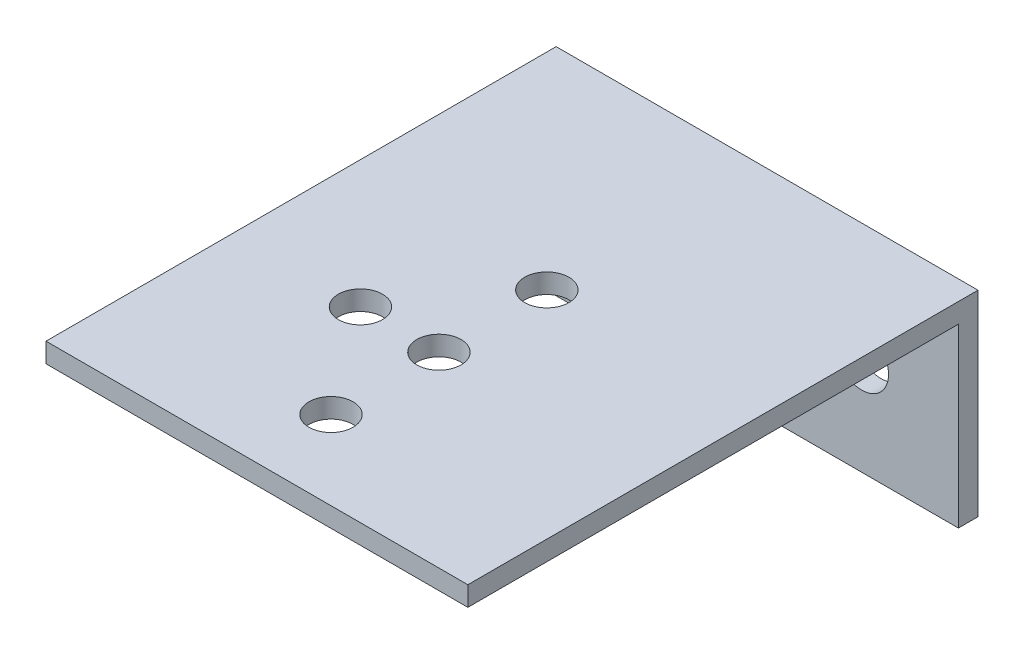
ISO-10303-21;
HEADER;
FILE_DESCRIPTION(('STEP AP214'),'2;1');
FILE_NAME('part.step','',(''),(''),'','','');
FILE_SCHEMA(('AUTOMOTIVE_DESIGN { 1 0 10303 214 1 1 1 1 }'));
ENDSEC;
DATA;
#1=APPLICATION_CONTEXT('core data for automotive mechanical design processes');
#2=APPLICATION_PROTOCOL_DEFINITION('international standard','automotive_design',2000,#1);
#3=PRODUCT_CONTEXT('',#1,'mechanical');
#4=PRODUCT('Part','Part','',(#3));
#5=PRODUCT_RELATED_PRODUCT_CATEGORY('part','',(#4));
#6=PRODUCT_DEFINITION_FORMATION('','',#4);
#7=PRODUCT_DEFINITION_CONTEXT('part definition',#1,'design');
#8=PRODUCT_DEFINITION('design','',#6,#7);
#9=PRODUCT_DEFINITION_SHAPE('','',#8);
#10=(LENGTH_UNIT() NAMED_UNIT(*) SI_UNIT(.MILLI.,.METRE.));
#11=(NAMED_UNIT(*) PLANE_ANGLE_UNIT() SI_UNIT($,.RADIAN.));
#12=(NAMED_UNIT(*) SI_UNIT($,.STERADIAN.) SOLID_ANGLE_UNIT());
#13=UNCERTAINTY_MEASURE_WITH_UNIT(LENGTH_MEASURE(1.E-05),#10,'distance_accuracy_value','');
#14=(GEOMETRIC_REPRESENTATION_CONTEXT(3) GLOBAL_UNCERTAINTY_ASSIGNED_CONTEXT((#13)) GLOBAL_UNIT_ASSIGNED_CONTEXT((#10,
#11,#12)) REPRESENTATION_CONTEXT('',''));
#15=CARTESIAN_POINT('',(0.,0.,0.));
#16=DIRECTION('',(0.,0.,1.));
#17=DIRECTION('',(1.,0.,0.));
#18=AXIS2_PLACEMENT_3D('',#15,#16,#17);
#19=CARTESIAN_POINT('',(-21.5,-10.,52.));
#20=DIRECTION('',(0.,1.,0.));
#21=DIRECTION('',(0.,0.,1.));
#22=AXIS2_PLACEMENT_3D('',#19,#20,#21);
#23=PLANE('',#22);
#24=DIRECTION('',(1.,0.,0.));
#25=VECTOR('',#24,1.);
#26=CARTESIAN_POINT('',(-21.5,-10.,1.99999999999999));
#27=LINE('',#26,#25);
#28=CARTESIAN_POINT('',(-21.5,-10.,1.99999999999999));
#29=VERTEX_POINT('',#28);
#30=CARTESIAN_POINT('',(21.5,-10.,1.99999999999999));
#31=VERTEX_POINT('',#30);
#32=EDGE_CURVE('E11',#29,#31,#27,.T.);
#33=ORIENTED_EDGE('',*,*,#32,.F.);
#34=DIRECTION('',(0.,0.,-1.));
#35=VECTOR('',#34,1.);
#36=CARTESIAN_POINT('',(-21.5,-10.,52.));
#37=LINE('',#36,#35);
#38=CARTESIAN_POINT('',(-21.5,-10.,0.));
#39=VERTEX_POINT('',#38);
#40=EDGE_CURVE('E89',#29,#39,#37,.T.);
#41=ORIENTED_EDGE('',*,*,#40,.T.);
#42=DIRECTION('',(1.,0.,0.));
#43=VECTOR('',#42,1.);
#44=CARTESIAN_POINT('',(-21.5,-10.,0.));
#45=LINE('',#44,#43);
#46=CARTESIAN_POINT('',(21.5,-10.,0.));
#47=VERTEX_POINT('',#46);
#48=EDGE_CURVE('E93',#39,#47,#45,.T.);
#49=ORIENTED_EDGE('',*,*,#48,.T.);
#50=DIRECTION('',(0.,0.,-1.));
#51=VECTOR('',#50,1.);
#52=CARTESIAN_POINT('',(21.5,-10.,52.));
#53=LINE('',#52,#51);
#54=EDGE_CURVE('E79',#31,#47,#53,.T.);
#55=ORIENTED_EDGE('',*,*,#54,.F.);
#56=EDGE_LOOP('',(#33,#41,#49,#55));
#57=FACE_BOUND('',#56,.T.);
#58=ADVANCED_FACE('F33',(#57),#23,.F.);
#59=CARTESIAN_POINT('',(21.5,-10.,52.));
#60=DIRECTION('',(-1.,0.,0.));
#61=DIRECTION('',(0.,0.,1.));
#62=AXIS2_PLACEMENT_3D('',#59,#60,#61);
#63=PLANE('',#62);
#64=DIRECTION('',(0.,1.,0.));
#65=VECTOR('',#64,1.);
#66=CARTESIAN_POINT('',(21.5,-10.,52.));
#67=LINE('',#66,#65);
#68=CARTESIAN_POINT('',(21.5,8.,52.));
#69=VERTEX_POINT('',#68);
#70=CARTESIAN_POINT('',(21.5,10.,52.));
#71=VERTEX_POINT('',#70);
#72=EDGE_CURVE('E98',#69,#71,#67,.T.);
#73=ORIENTED_EDGE('',*,*,#72,.F.);
#74=DIRECTION('',(0.,0.,-1.));
#75=VECTOR('',#74,1.);
#76=CARTESIAN_POINT('',(21.5,8.,52.));
#77=LINE('',#76,#75);
#78=CARTESIAN_POINT('',(21.5,8.,1.99999999999999));
#79=VERTEX_POINT('',#78);
#80=EDGE_CURVE('E50',#69,#79,#77,.T.);
#81=ORIENTED_EDGE('',*,*,#80,.T.);
#82=DIRECTION('',(0.,1.,0.));
#83=VECTOR('',#82,1.);
#84=CARTESIAN_POINT('',(21.5,-10.,1.99999999999999));
#85=LINE('',#84,#83);
#86=EDGE_CURVE('E86',#31,#79,#85,.T.);
#87=ORIENTED_EDGE('',*,*,#86,.F.);
#88=ORIENTED_EDGE('',*,*,#54,.T.);
#89=DIRECTION('',(0.,1.,0.));
#90=VECTOR('',#89,1.);
#91=CARTESIAN_POINT('',(21.5,-10.,0.));
#92=LINE('',#91,#90);
#93=CARTESIAN_POINT('',(21.5,10.,0.));
#94=VERTEX_POINT('',#93);
#95=EDGE_CURVE('E84',#47,#94,#92,.T.);
#96=ORIENTED_EDGE('',*,*,#95,.T.);
#97=DIRECTION('',(0.,0.,-1.));
#98=VECTOR('',#97,1.);
#99=CARTESIAN_POINT('',(21.5,10.,52.));
#100=LINE('',#99,#98);
#101=EDGE_CURVE('E116',#71,#94,#100,.T.);
#102=ORIENTED_EDGE('',*,*,#101,.F.);
#103=EDGE_LOOP('',(#73,#81,#87,#88,#96,#102));
#104=FACE_BOUND('',#103,.T.);
#105=ADVANCED_FACE('F35',(#104),#63,.F.);
#106=CARTESIAN_POINT('',(-21.5,10.,52.));
#107=DIRECTION('',(0.,-1.,0.));
#108=DIRECTION('',(0.,0.,-1.));
#109=AXIS2_PLACEMENT_3D('',#106,#107,#108);
#110=PLANE('',#109);
#111=CARTESIAN_POINT('',(-0.500000000201693,10.,21.9500000003336));
#112=DIRECTION('',(0.,1.,0.));
#113=DIRECTION('',(0.,0.,1.));
#114=AXIS2_PLACEMENT_3D('',#111,#112,#113);
#115=CIRCLE('',#114,2.24999999999999);
#116=CARTESIAN_POINT('',(-0.500000000201693,10.,24.2000000003335));
#117=VERTEX_POINT('',#116);
#118=EDGE_CURVE('E134',#117,#117,#115,.T.);
#119=ORIENTED_EDGE('',*,*,#118,.F.);
#120=EDGE_LOOP('',(#119));
#121=FACE_BOUND('',#120,.T.);
#122=CARTESIAN_POINT('',(-0.500000000201693,10.,32.9500000003336));
#123=DIRECTION('',(0.,1.,0.));
#124=DIRECTION('',(0.,0.,1.));
#125=AXIS2_PLACEMENT_3D('',#122,#123,#124);
#126=CIRCLE('',#125,2.24999999999999);
#127=CARTESIAN_POINT('',(-0.500000000201693,10.,35.2000000003335));
#128=VERTEX_POINT('',#127);
#129=EDGE_CURVE('E131',#128,#128,#126,.T.);
#130=ORIENTED_EDGE('',*,*,#129,.F.);
#131=EDGE_LOOP('',(#130));
#132=FACE_BOUND('',#131,.T.);
#133=CARTESIAN_POINT('',(-0.500000000201693,10.,43.9500000003336));
#134=DIRECTION('',(0.,1.,0.));
#135=DIRECTION('',(0.,0.,1.));
#136=AXIS2_PLACEMENT_3D('',#133,#134,#135);
#137=CIRCLE('',#136,2.24999999999999);
#138=CARTESIAN_POINT('',(-0.500000000201693,10.,46.2000000003335));
#139=VERTEX_POINT('',#138);
#140=EDGE_CURVE('E127',#139,#139,#137,.T.);
#141=ORIENTED_EDGE('',*,*,#140,.F.);
#142=EDGE_LOOP('',(#141));
#143=FACE_BOUND('',#142,.T.);
#144=CARTESIAN_POINT('',(-8.50000000020169,10.,32.9500000003336));
#145=DIRECTION('',(0.,1.,0.));
#146=DIRECTION('',(0.,0.,1.));
#147=AXIS2_PLACEMENT_3D('',#144,#145,#146);
#148=CIRCLE('',#147,2.24999999999999);
#149=CARTESIAN_POINT('',(-8.50000000020169,10.,35.2000000003335));
#150=VERTEX_POINT('',#149);
#151=EDGE_CURVE('E123',#150,#150,#148,.T.);
#152=ORIENTED_EDGE('',*,*,#151,.F.);
#153=EDGE_LOOP('',(#152));
#154=FACE_BOUND('',#153,.T.);
#155=DIRECTION('',(-1.,0.,0.));
#156=VECTOR('',#155,1.);
#157=CARTESIAN_POINT('',(-21.5,10.,0.));
#158=LINE('',#157,#156);
#159=CARTESIAN_POINT('',(-21.5,10.,0.));
#160=VERTEX_POINT('',#159);
#161=EDGE_CURVE('E102',#94,#160,#158,.T.);
#162=ORIENTED_EDGE('',*,*,#161,.T.);
#163=DIRECTION('',(0.,0.,-1.));
#164=VECTOR('',#163,1.);
#165=CARTESIAN_POINT('',(-21.5,10.,52.));
#166=LINE('',#165,#164);
#167=CARTESIAN_POINT('',(-21.5,10.,52.));
#168=VERTEX_POINT('',#167);
#169=EDGE_CURVE('E113',#168,#160,#166,.T.);
#170=ORIENTED_EDGE('',*,*,#169,.F.);
#171=DIRECTION('',(-1.,0.,0.));
#172=VECTOR('',#171,1.);
#173=CARTESIAN_POINT('',(-21.5,10.,52.));
#174=LINE('',#173,#172);
#175=EDGE_CURVE('E59',#71,#168,#174,.T.);
#176=ORIENTED_EDGE('',*,*,#175,.F.);
#177=ORIENTED_EDGE('',*,*,#101,.T.);
#178=EDGE_LOOP('',(#162,#170,#176,#177));
#179=FACE_BOUND('',#178,.T.);
#180=ADVANCED_FACE('F202',(#121,#132,#143,#154,#179),#110,.F.);
#181=CARTESIAN_POINT('',(-21.5,-10.,52.));
#182=DIRECTION('',(1.,0.,0.));
#183=DIRECTION('',(0.,0.,-1.));
#184=AXIS2_PLACEMENT_3D('',#181,#182,#183);
#185=PLANE('',#184);
#186=DIRECTION('',(0.,-1.,0.));
#187=VECTOR('',#186,1.);
#188=CARTESIAN_POINT('',(-21.5,-10.,1.99999999999999));
#189=LINE('',#188,#187);
#190=CARTESIAN_POINT('',(-21.5,8.,1.99999999999999));
#191=VERTEX_POINT('',#190);
#192=EDGE_CURVE('E106',#191,#29,#189,.T.);
#193=ORIENTED_EDGE('',*,*,#192,.F.);
#194=DIRECTION('',(0.,0.,1.));
#195=VECTOR('',#194,1.);
#196=CARTESIAN_POINT('',(-21.5,8.,52.));
#197=LINE('',#196,#195);
#198=CARTESIAN_POINT('',(-21.5,8.,52.));
#199=VERTEX_POINT('',#198);
#200=EDGE_CURVE('E158',#191,#199,#197,.T.);
#201=ORIENTED_EDGE('',*,*,#200,.T.);
#202=DIRECTION('',(0.,-1.,0.));
#203=VECTOR('',#202,1.);
#204=CARTESIAN_POINT('',(-21.5,-10.,52.));
#205=LINE('',#204,#203);
#206=EDGE_CURVE('E90',#168,#199,#205,.T.);
#207=ORIENTED_EDGE('',*,*,#206,.F.);
#208=ORIENTED_EDGE('',*,*,#169,.T.);
#209=DIRECTION('',(0.,-1.,0.));
#210=VECTOR('',#209,1.);
#211=CARTESIAN_POINT('',(-21.5,-10.,0.));
#212=LINE('',#211,#210);
#213=EDGE_CURVE('E99',#160,#39,#212,.T.);
#214=ORIENTED_EDGE('',*,*,#213,.T.);
#215=ORIENTED_EDGE('',*,*,#40,.F.);
#216=EDGE_LOOP('',(#193,#201,#207,#208,#214,#215));
#217=FACE_BOUND('',#216,.T.);
#218=ADVANCED_FACE('F171',(#217),#185,.F.);
#219=CARTESIAN_POINT('',(0.,0.,52.));
#220=DIRECTION('',(0.,0.,-1.));
#221=DIRECTION('',(-1.,0.,0.));
#222=AXIS2_PLACEMENT_3D('',#219,#220,#221);
#223=PLANE('',#222);
#224=ORIENTED_EDGE('',*,*,#206,.T.);
#225=DIRECTION('',(1.,0.,0.));
#226=VECTOR('',#225,1.);
#227=CARTESIAN_POINT('',(0.,8.,52.));
#228=LINE('',#227,#226);
#229=EDGE_CURVE('E42',#199,#69,#228,.T.);
#230=ORIENTED_EDGE('',*,*,#229,.T.);
#231=ORIENTED_EDGE('',*,*,#72,.T.);
#232=ORIENTED_EDGE('',*,*,#175,.T.);
#233=EDGE_LOOP('',(#224,#230,#231,#232));
#234=FACE_BOUND('',#233,.T.);
#235=ADVANCED_FACE('F166',(#234),#223,.F.);
#236=CARTESIAN_POINT('',(0.,0.,0.));
#237=DIRECTION('',(0.,0.,-1.));
#238=DIRECTION('',(-1.,0.,0.));
#239=AXIS2_PLACEMENT_3D('',#236,#237,#238);
#240=PLANE('',#239);
#241=CARTESIAN_POINT('',(11.632687114556,0.,0.));
#242=DIRECTION('',(0.,0.,-1.));
#243=DIRECTION('',(-1.,0.,0.));
#244=AXIS2_PLACEMENT_3D('',#241,#242,#243);
#245=CIRCLE('',#244,2.75);
#246=CARTESIAN_POINT('',(8.88268711455601,0.,0.));
#247=VERTEX_POINT('',#246);
#248=EDGE_CURVE('E147',#247,#247,#245,.T.);
#249=ORIENTED_EDGE('',*,*,#248,.F.);
#250=EDGE_LOOP('',(#249));
#251=FACE_BOUND('',#250,.T.);
#252=CARTESIAN_POINT('',(-8.68660375483188,0.,0.));
#253=DIRECTION('',(0.,0.,-1.));
#254=DIRECTION('',(-1.,0.,0.));
#255=AXIS2_PLACEMENT_3D('',#252,#253,#254);
#256=CIRCLE('',#255,2.75);
#257=CARTESIAN_POINT('',(-11.4366037548319,0.,0.));
#258=VERTEX_POINT('',#257);
#259=EDGE_CURVE('E137',#258,#258,#256,.T.);
#260=ORIENTED_EDGE('',*,*,#259,.F.);
#261=EDGE_LOOP('',(#260));
#262=FACE_BOUND('',#261,.T.);
#263=ORIENTED_EDGE('',*,*,#95,.F.);
#264=ORIENTED_EDGE('',*,*,#48,.F.);
#265=ORIENTED_EDGE('',*,*,#213,.F.);
#266=ORIENTED_EDGE('',*,*,#161,.F.);
#267=EDGE_LOOP('',(#263,#264,#265,#266));
#268=FACE_BOUND('',#267,.T.);
#269=ADVANCED_FACE('F101',(#251,#262,#268),#240,.T.);
#270=CARTESIAN_POINT('',(0.,0.,1.99999999999999));
#271=DIRECTION('',(0.,0.,1.));
#272=DIRECTION('',(1.,0.,0.));
#273=AXIS2_PLACEMENT_3D('',#270,#271,#272);
#274=PLANE('',#273);
#275=CARTESIAN_POINT('',(11.632687114556,0.,1.99999999999999));
#276=DIRECTION('',(0.,0.,1.));
#277=DIRECTION('',(1.,0.,0.));
#278=AXIS2_PLACEMENT_3D('',#275,#276,#277);
#279=CIRCLE('',#278,2.75);
#280=CARTESIAN_POINT('',(14.382687114556,0.,1.99999999999999));
#281=VERTEX_POINT('',#280);
#282=EDGE_CURVE('E37',#281,#281,#279,.T.);
#283=ORIENTED_EDGE('',*,*,#282,.F.);
#284=EDGE_LOOP('',(#283));
#285=FACE_BOUND('',#284,.T.);
#286=CARTESIAN_POINT('',(-8.68660375483188,0.,1.99999999999999));
#287=DIRECTION('',(0.,0.,1.));
#288=DIRECTION('',(1.,0.,0.));
#289=AXIS2_PLACEMENT_3D('',#286,#287,#288);
#290=CIRCLE('',#289,2.75);
#291=CARTESIAN_POINT('',(-5.93660375483188,0.,1.99999999999999));
#292=VERTEX_POINT('',#291);
#293=EDGE_CURVE('E135',#292,#292,#290,.T.);
#294=ORIENTED_EDGE('',*,*,#293,.F.);
#295=EDGE_LOOP('',(#294));
#296=FACE_BOUND('',#295,.T.);
#297=ORIENTED_EDGE('',*,*,#86,.T.);
#298=DIRECTION('',(-1.,0.,0.));
#299=VECTOR('',#298,1.);
#300=CARTESIAN_POINT('',(30.2088614005527,8.,1.99999999999999));
#301=LINE('',#300,#299);
#302=EDGE_CURVE('E122',#79,#191,#301,.T.);
#303=ORIENTED_EDGE('',*,*,#302,.T.);
#304=ORIENTED_EDGE('',*,*,#192,.T.);
#305=ORIENTED_EDGE('',*,*,#32,.T.);
#306=EDGE_LOOP('',(#297,#303,#304,#305));
#307=FACE_BOUND('',#306,.T.);
#308=ADVANCED_FACE('F178',(#285,#296,#307),#274,.T.);
#309=CARTESIAN_POINT('',(30.2088614005527,8.,1.99999999999999));
#310=DIRECTION('',(0.,1.,0.));
#311=DIRECTION('',(0.,0.,1.));
#312=AXIS2_PLACEMENT_3D('',#309,#310,#311);
#313=PLANE('',#312);
#314=CARTESIAN_POINT('',(-0.500000000201693,8.,21.9500000003336));
#315=DIRECTION('',(0.,1.,0.));
#316=DIRECTION('',(0.,0.,1.));
#317=AXIS2_PLACEMENT_3D('',#314,#315,#316);
#318=CIRCLE('',#317,2.24999999999999);
#319=CARTESIAN_POINT('',(-0.500000000201693,8.,24.2000000003335));
#320=VERTEX_POINT('',#319);
#321=EDGE_CURVE('E132',#320,#320,#318,.T.);
#322=ORIENTED_EDGE('',*,*,#321,.T.);
#323=EDGE_LOOP('',(#322));
#324=FACE_BOUND('',#323,.T.);
#325=CARTESIAN_POINT('',(-0.500000000201693,8.,32.9500000003336));
#326=DIRECTION('',(0.,1.,0.));
#327=DIRECTION('',(0.,0.,1.));
#328=AXIS2_PLACEMENT_3D('',#325,#326,#327);
#329=CIRCLE('',#328,2.24999999999999);
#330=CARTESIAN_POINT('',(-0.500000000201693,8.,35.2000000003336));
#331=VERTEX_POINT('',#330);
#332=EDGE_CURVE('E128',#331,#331,#329,.T.);
#333=ORIENTED_EDGE('',*,*,#332,.T.);
#334=EDGE_LOOP('',(#333));
#335=FACE_BOUND('',#334,.T.);
#336=CARTESIAN_POINT('',(-0.500000000201693,8.,43.9500000003336));
#337=DIRECTION('',(0.,1.,0.));
#338=DIRECTION('',(0.,0.,1.));
#339=AXIS2_PLACEMENT_3D('',#336,#337,#338);
#340=CIRCLE('',#339,2.24999999999999);
#341=CARTESIAN_POINT('',(-0.500000000201693,8.,46.2000000003336));
#342=VERTEX_POINT('',#341);
#343=EDGE_CURVE('E124',#342,#342,#340,.T.);
#344=ORIENTED_EDGE('',*,*,#343,.T.);
#345=EDGE_LOOP('',(#344));
#346=FACE_BOUND('',#345,.T.);
#347=CARTESIAN_POINT('',(-8.50000000020169,8.,32.9500000003336));
#348=DIRECTION('',(0.,1.,0.));
#349=DIRECTION('',(0.,0.,1.));
#350=AXIS2_PLACEMENT_3D('',#347,#348,#349);
#351=CIRCLE('',#350,2.24999999999999);
#352=CARTESIAN_POINT('',(-8.50000000020169,8.,35.2000000003336));
#353=VERTEX_POINT('',#352);
#354=EDGE_CURVE('E119',#353,#353,#351,.T.);
#355=ORIENTED_EDGE('',*,*,#354,.T.);
#356=EDGE_LOOP('',(#355));
#357=FACE_BOUND('',#356,.T.);
#358=ORIENTED_EDGE('',*,*,#229,.F.);
#359=ORIENTED_EDGE('',*,*,#200,.F.);
#360=ORIENTED_EDGE('',*,*,#302,.F.);
#361=ORIENTED_EDGE('',*,*,#80,.F.);
#362=EDGE_LOOP('',(#358,#359,#360,#361));
#363=FACE_BOUND('',#362,.T.);
#364=ADVANCED_FACE('F174',(#324,#335,#346,#357,#363),#313,.F.);
#365=CARTESIAN_POINT('',(-8.50000000020169,10.,32.9500000003336));
#366=DIRECTION('',(0.,1.,0.));
#367=DIRECTION('',(0.,0.,1.));
#368=AXIS2_PLACEMENT_3D('',#365,#366,#367);
#369=CYLINDRICAL_SURFACE('',#368,2.24999999999999);
#370=ORIENTED_EDGE('',*,*,#151,.T.);
#371=EDGE_LOOP('',(#370));
#372=FACE_BOUND('',#371,.T.);
#373=ORIENTED_EDGE('',*,*,#354,.F.);
#374=EDGE_LOOP('',(#373));
#375=FACE_BOUND('',#374,.T.);
#376=ADVANCED_FACE('F189',(#372,#375),#369,.F.);
#377=CARTESIAN_POINT('',(-0.500000000201693,10.,43.9500000003336));
#378=DIRECTION('',(0.,1.,0.));
#379=DIRECTION('',(0.,0.,1.));
#380=AXIS2_PLACEMENT_3D('',#377,#378,#379);
#381=CYLINDRICAL_SURFACE('',#380,2.24999999999999);
#382=ORIENTED_EDGE('',*,*,#140,.T.);
#383=EDGE_LOOP('',(#382));
#384=FACE_BOUND('',#383,.T.);
#385=ORIENTED_EDGE('',*,*,#343,.F.);
#386=EDGE_LOOP('',(#385));
#387=FACE_BOUND('',#386,.T.);
#388=ADVANCED_FACE('F222',(#384,#387),#381,.F.);
#389=CARTESIAN_POINT('',(-0.500000000201693,10.,32.9500000003336));
#390=DIRECTION('',(0.,1.,0.));
#391=DIRECTION('',(0.,0.,1.));
#392=AXIS2_PLACEMENT_3D('',#389,#390,#391);
#393=CYLINDRICAL_SURFACE('',#392,2.24999999999999);
#394=ORIENTED_EDGE('',*,*,#129,.T.);
#395=EDGE_LOOP('',(#394));
#396=FACE_BOUND('',#395,.T.);
#397=ORIENTED_EDGE('',*,*,#332,.F.);
#398=EDGE_LOOP('',(#397));
#399=FACE_BOUND('',#398,.T.);
#400=ADVANCED_FACE('F229',(#396,#399),#393,.F.);
#401=CARTESIAN_POINT('',(-0.500000000201693,10.,21.9500000003336));
#402=DIRECTION('',(0.,1.,0.));
#403=DIRECTION('',(0.,0.,1.));
#404=AXIS2_PLACEMENT_3D('',#401,#402,#403);
#405=CYLINDRICAL_SURFACE('',#404,2.24999999999999);
#406=ORIENTED_EDGE('',*,*,#118,.T.);
#407=EDGE_LOOP('',(#406));
#408=FACE_BOUND('',#407,.T.);
#409=ORIENTED_EDGE('',*,*,#321,.F.);
#410=EDGE_LOOP('',(#409));
#411=FACE_BOUND('',#410,.T.);
#412=ADVANCED_FACE('F235',(#408,#411),#405,.F.);
#413=CARTESIAN_POINT('',(-8.68660375483188,0.,0.));
#414=DIRECTION('',(0.,0.,-1.));
#415=DIRECTION('',(-1.,0.,0.));
#416=AXIS2_PLACEMENT_3D('',#413,#414,#415);
#417=CYLINDRICAL_SURFACE('',#416,2.75);
#418=ORIENTED_EDGE('',*,*,#293,.T.);
#419=EDGE_LOOP('',(#418));
#420=FACE_BOUND('',#419,.T.);
#421=ORIENTED_EDGE('',*,*,#259,.T.);
#422=EDGE_LOOP('',(#421));
#423=FACE_BOUND('',#422,.T.);
#424=ADVANCED_FACE('F239',(#420,#423),#417,.F.);
#425=CARTESIAN_POINT('',(11.632687114556,0.,0.));
#426=DIRECTION('',(0.,0.,-1.));
#427=DIRECTION('',(-1.,0.,0.));
#428=AXIS2_PLACEMENT_3D('',#425,#426,#427);
#429=CYLINDRICAL_SURFACE('',#428,2.75);
#430=ORIENTED_EDGE('',*,*,#282,.T.);
#431=EDGE_LOOP('',(#430));
#432=FACE_BOUND('',#431,.T.);
#433=ORIENTED_EDGE('',*,*,#248,.T.);
#434=EDGE_LOOP('',(#433));
#435=FACE_BOUND('',#434,.T.);
#436=ADVANCED_FACE('F243',(#432,#435),#429,.F.);
#437=CLOSED_SHELL('',(#58,#105,#180,#218,#235,#269,#308,#364,#376,#388,#400,#412,#424,#436));
#438=MANIFOLD_SOLID_BREP('B2',#437);
#439=ADVANCED_BREP_SHAPE_REPRESENTATION('',(#18,#438),#14);
#440=SHAPE_DEFINITION_REPRESENTATION(#9,#439);
ENDSEC;
END-ISO-10303-21;
